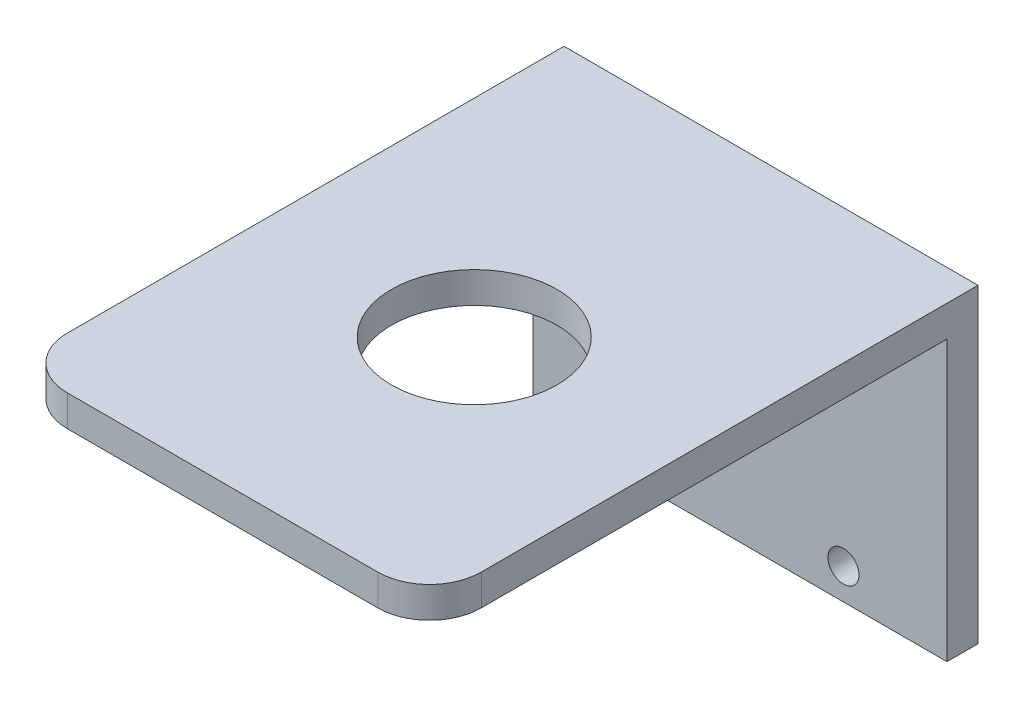
ISO-10303-21;
HEADER;
FILE_DESCRIPTION(('STEP AP214'),'2;1');
FILE_NAME('part.step','',(''),(''),'','','');
FILE_SCHEMA(('AUTOMOTIVE_DESIGN { 1 0 10303 214 1 1 1 1 }'));
ENDSEC;
DATA;
#1=APPLICATION_CONTEXT('core data for automotive mechanical design processes');
#2=APPLICATION_PROTOCOL_DEFINITION('international standard','automotive_design',2000,#1);
#3=PRODUCT_CONTEXT('',#1,'mechanical');
#4=PRODUCT('Part','Part','',(#3));
#5=PRODUCT_RELATED_PRODUCT_CATEGORY('part','',(#4));
#6=PRODUCT_DEFINITION_FORMATION('','',#4);
#7=PRODUCT_DEFINITION_CONTEXT('part definition',#1,'design');
#8=PRODUCT_DEFINITION('design','',#6,#7);
#9=PRODUCT_DEFINITION_SHAPE('','',#8);
#10=(LENGTH_UNIT() NAMED_UNIT(*) SI_UNIT(.MILLI.,.METRE.));
#11=(NAMED_UNIT(*) PLANE_ANGLE_UNIT() SI_UNIT($,.RADIAN.));
#12=(NAMED_UNIT(*) SI_UNIT($,.STERADIAN.) SOLID_ANGLE_UNIT());
#13=UNCERTAINTY_MEASURE_WITH_UNIT(LENGTH_MEASURE(1.E-05),#10,'distance_accuracy_value','');
#14=(GEOMETRIC_REPRESENTATION_CONTEXT(3) GLOBAL_UNCERTAINTY_ASSIGNED_CONTEXT((#13)) GLOBAL_UNIT_ASSIGNED_CONTEXT((#10,
#11,#12)) REPRESENTATION_CONTEXT('',''));
#15=CARTESIAN_POINT('',(0.,0.,0.));
#16=DIRECTION('',(0.,0.,1.));
#17=DIRECTION('',(1.,0.,0.));
#18=AXIS2_PLACEMENT_3D('',#15,#16,#17);
#19=CARTESIAN_POINT('',(0.,0.,3.));
#20=DIRECTION('',(0.,0.,1.));
#21=DIRECTION('',(1.,0.,0.));
#22=AXIS2_PLACEMENT_3D('',#19,#20,#21);
#23=PLANE('',#22);
#24=DIRECTION('',(1.,0.,0.));
#25=VECTOR('',#24,1.);
#26=CARTESIAN_POINT('',(-20.,12.,3.));
#27=LINE('',#26,#25);
#28=CARTESIAN_POINT('',(-20.,12.,3.));
#29=VERTEX_POINT('',#28);
#30=CARTESIAN_POINT('',(20.,12.,3.));
#31=VERTEX_POINT('',#30);
#32=EDGE_CURVE('E115',#29,#31,#27,.T.);
#33=ORIENTED_EDGE('',*,*,#32,.F.);
#34=DIRECTION('',(0.,-1.,0.));
#35=VECTOR('',#34,1.);
#36=CARTESIAN_POINT('',(-20.,15.,3.));
#37=LINE('',#36,#35);
#38=CARTESIAN_POINT('',(-20.,-15.,3.));
#39=VERTEX_POINT('',#38);
#40=EDGE_CURVE('E120',#29,#39,#37,.T.);
#41=ORIENTED_EDGE('',*,*,#40,.T.);
#42=DIRECTION('',(1.,0.,0.));
#43=VECTOR('',#42,1.);
#44=CARTESIAN_POINT('',(-20.,-15.,3.));
#45=LINE('',#44,#43);
#46=CARTESIAN_POINT('',(20.,-15.,3.));
#47=VERTEX_POINT('',#46);
#48=EDGE_CURVE('E118',#39,#47,#45,.T.);
#49=ORIENTED_EDGE('',*,*,#48,.T.);
#50=DIRECTION('',(0.,1.,0.));
#51=VECTOR('',#50,1.);
#52=CARTESIAN_POINT('',(20.,15.,3.));
#53=LINE('',#52,#51);
#54=EDGE_CURVE('E104',#47,#31,#53,.T.);
#55=ORIENTED_EDGE('',*,*,#54,.T.);
#56=EDGE_LOOP('',(#33,#41,#49,#55));
#57=FACE_BOUND('',#56,.T.);
#58=CARTESIAN_POINT('',(-9.99999999999979,-12.,3.));
#59=DIRECTION('',(0.,0.,1.));
#60=DIRECTION('',(1.,0.,0.));
#61=AXIS2_PLACEMENT_3D('',#58,#59,#60);
#62=CIRCLE('',#61,1.5);
#63=CARTESIAN_POINT('',(-8.49999999999979,-12.,3.));
#64=VERTEX_POINT('',#63);
#65=EDGE_CURVE('E149',#64,#64,#62,.T.);
#66=ORIENTED_EDGE('',*,*,#65,.F.);
#67=EDGE_LOOP('',(#66));
#68=FACE_BOUND('',#67,.T.);
#69=CARTESIAN_POINT('',(-10.,8.00000000000001,3.));
#70=DIRECTION('',(0.,0.,1.));
#71=DIRECTION('',(1.,0.,0.));
#72=AXIS2_PLACEMENT_3D('',#69,#70,#71);
#73=CIRCLE('',#72,1.5);
#74=CARTESIAN_POINT('',(-8.5,8.00000000000001,3.));
#75=VERTEX_POINT('',#74);
#76=EDGE_CURVE('E161',#75,#75,#73,.T.);
#77=ORIENTED_EDGE('',*,*,#76,.F.);
#78=EDGE_LOOP('',(#77));
#79=FACE_BOUND('',#78,.T.);
#80=CARTESIAN_POINT('',(10.,8.00000000000001,3.));
#81=DIRECTION('',(0.,0.,1.));
#82=DIRECTION('',(1.,0.,0.));
#83=AXIS2_PLACEMENT_3D('',#80,#81,#82);
#84=CIRCLE('',#83,1.5);
#85=CARTESIAN_POINT('',(11.5,8.00000000000001,3.));
#86=VERTEX_POINT('',#85);
#87=EDGE_CURVE('E155',#86,#86,#84,.T.);
#88=ORIENTED_EDGE('',*,*,#87,.F.);
#89=EDGE_LOOP('',(#88));
#90=FACE_BOUND('',#89,.T.);
#91=CARTESIAN_POINT('',(10.0000000000002,-12.,3.));
#92=DIRECTION('',(0.,0.,1.));
#93=DIRECTION('',(1.,0.,0.));
#94=AXIS2_PLACEMENT_3D('',#91,#92,#93);
#95=CIRCLE('',#94,1.5);
#96=CARTESIAN_POINT('',(11.5000000000002,-12.,3.));
#97=VERTEX_POINT('',#96);
#98=EDGE_CURVE('E142',#97,#97,#95,.T.);
#99=ORIENTED_EDGE('',*,*,#98,.F.);
#100=EDGE_LOOP('',(#99));
#101=FACE_BOUND('',#100,.T.);
#102=ADVANCED_FACE('F35',(#57,#68,#79,#90,#101),#23,.T.);
#103=CARTESIAN_POINT('',(0.,0.,0.));
#104=DIRECTION('',(0.,0.,1.));
#105=DIRECTION('',(1.,0.,0.));
#106=AXIS2_PLACEMENT_3D('',#103,#104,#105);
#107=PLANE('',#106);
#108=CARTESIAN_POINT('',(-9.99999999999979,-12.,0.));
#109=DIRECTION('',(0.,0.,1.));
#110=DIRECTION('',(1.,0.,0.));
#111=AXIS2_PLACEMENT_3D('',#108,#109,#110);
#112=CIRCLE('',#111,1.5);
#113=CARTESIAN_POINT('',(-8.49999999999979,-12.,0.));
#114=VERTEX_POINT('',#113);
#115=EDGE_CURVE('E145',#114,#114,#112,.T.);
#116=ORIENTED_EDGE('',*,*,#115,.T.);
#117=EDGE_LOOP('',(#116));
#118=FACE_BOUND('',#117,.T.);
#119=CARTESIAN_POINT('',(-10.,8.00000000000001,0.));
#120=DIRECTION('',(0.,0.,1.));
#121=DIRECTION('',(1.,0.,0.));
#122=AXIS2_PLACEMENT_3D('',#119,#120,#121);
#123=CIRCLE('',#122,1.5);
#124=CARTESIAN_POINT('',(-8.5,8.00000000000001,0.));
#125=VERTEX_POINT('',#124);
#126=EDGE_CURVE('E158',#125,#125,#123,.T.);
#127=ORIENTED_EDGE('',*,*,#126,.T.);
#128=EDGE_LOOP('',(#127));
#129=FACE_BOUND('',#128,.T.);
#130=DIRECTION('',(0.,1.,0.));
#131=VECTOR('',#130,1.);
#132=CARTESIAN_POINT('',(20.,15.,0.));
#133=LINE('',#132,#131);
#134=CARTESIAN_POINT('',(20.,-15.,0.));
#135=VERTEX_POINT('',#134);
#136=CARTESIAN_POINT('',(20.,15.,0.));
#137=VERTEX_POINT('',#136);
#138=EDGE_CURVE('E164',#135,#137,#133,.T.);
#139=ORIENTED_EDGE('',*,*,#138,.F.);
#140=DIRECTION('',(1.,0.,0.));
#141=VECTOR('',#140,1.);
#142=CARTESIAN_POINT('',(-20.,-15.,0.));
#143=LINE('',#142,#141);
#144=CARTESIAN_POINT('',(-20.,-15.,0.));
#145=VERTEX_POINT('',#144);
#146=EDGE_CURVE('E121',#145,#135,#143,.T.);
#147=ORIENTED_EDGE('',*,*,#146,.F.);
#148=DIRECTION('',(0.,-1.,0.));
#149=VECTOR('',#148,1.);
#150=CARTESIAN_POINT('',(-20.,15.,0.));
#151=LINE('',#150,#149);
#152=CARTESIAN_POINT('',(-20.,15.,0.));
#153=VERTEX_POINT('',#152);
#154=EDGE_CURVE('E182',#153,#145,#151,.T.);
#155=ORIENTED_EDGE('',*,*,#154,.F.);
#156=DIRECTION('',(-1.,0.,0.));
#157=VECTOR('',#156,1.);
#158=CARTESIAN_POINT('',(-20.,15.,0.));
#159=LINE('',#158,#157);
#160=EDGE_CURVE('E184',#137,#153,#159,.T.);
#161=ORIENTED_EDGE('',*,*,#160,.F.);
#162=EDGE_LOOP('',(#139,#147,#155,#161));
#163=FACE_BOUND('',#162,.T.);
#164=CARTESIAN_POINT('',(10.,8.00000000000001,0.));
#165=DIRECTION('',(0.,0.,1.));
#166=DIRECTION('',(1.,0.,0.));
#167=AXIS2_PLACEMENT_3D('',#164,#165,#166);
#168=CIRCLE('',#167,1.5);
#169=CARTESIAN_POINT('',(11.5,8.00000000000001,0.));
#170=VERTEX_POINT('',#169);
#171=EDGE_CURVE('E152',#170,#170,#168,.T.);
#172=ORIENTED_EDGE('',*,*,#171,.T.);
#173=EDGE_LOOP('',(#172));
#174=FACE_BOUND('',#173,.T.);
#175=CARTESIAN_POINT('',(10.0000000000002,-12.,0.));
#176=DIRECTION('',(0.,0.,1.));
#177=DIRECTION('',(1.,0.,0.));
#178=AXIS2_PLACEMENT_3D('',#175,#176,#177);
#179=CIRCLE('',#178,1.5);
#180=CARTESIAN_POINT('',(11.5000000000002,-12.,0.));
#181=VERTEX_POINT('',#180);
#182=EDGE_CURVE('E146',#181,#181,#179,.T.);
#183=ORIENTED_EDGE('',*,*,#182,.T.);
#184=EDGE_LOOP('',(#183));
#185=FACE_BOUND('',#184,.T.);
#186=ADVANCED_FACE('F197',(#118,#129,#163,#174,#185),#107,.F.);
#187=CARTESIAN_POINT('',(20.,15.,3.));
#188=DIRECTION('',(-1.,0.,0.));
#189=DIRECTION('',(0.,-1.,0.));
#190=AXIS2_PLACEMENT_3D('',#187,#188,#189);
#191=PLANE('',#190);
#192=DIRECTION('',(0.,0.,-1.));
#193=VECTOR('',#192,1.);
#194=CARTESIAN_POINT('',(20.,15.,3.));
#195=LINE('',#194,#193);
#196=CARTESIAN_POINT('',(20.,15.,48.));
#197=VERTEX_POINT('',#196);
#198=EDGE_CURVE('E171',#197,#137,#195,.T.);
#199=ORIENTED_EDGE('',*,*,#198,.F.);
#200=DIRECTION('',(0.,1.,0.));
#201=VECTOR('',#200,1.);
#202=CARTESIAN_POINT('',(20.,12.,48.));
#203=LINE('',#202,#201);
#204=CARTESIAN_POINT('',(20.,12.,48.));
#205=VERTEX_POINT('',#204);
#206=EDGE_CURVE('E11',#197,#205,#203,.F.);
#207=ORIENTED_EDGE('',*,*,#206,.T.);
#208=DIRECTION('',(0.,0.,-1.));
#209=VECTOR('',#208,1.);
#210=CARTESIAN_POINT('',(20.,12.,53.));
#211=LINE('',#210,#209);
#212=EDGE_CURVE('E100',#205,#31,#211,.T.);
#213=ORIENTED_EDGE('',*,*,#212,.T.);
#214=ORIENTED_EDGE('',*,*,#54,.F.);
#215=DIRECTION('',(0.,0.,-1.));
#216=VECTOR('',#215,1.);
#217=CARTESIAN_POINT('',(20.,-15.,3.));
#218=LINE('',#217,#216);
#219=EDGE_CURVE('E179',#47,#135,#218,.T.);
#220=ORIENTED_EDGE('',*,*,#219,.T.);
#221=ORIENTED_EDGE('',*,*,#138,.T.);
#222=EDGE_LOOP('',(#199,#207,#213,#214,#220,#221));
#223=FACE_BOUND('',#222,.T.);
#224=ADVANCED_FACE('F102',(#223),#191,.F.);
#225=CARTESIAN_POINT('',(-20.,15.,3.));
#226=DIRECTION('',(0.,-1.,0.));
#227=DIRECTION('',(0.,0.,-1.));
#228=AXIS2_PLACEMENT_3D('',#225,#226,#227);
#229=PLANE('',#228);
#230=CARTESIAN_POINT('',(0.,15.,28.6810804826567));
#231=DIRECTION('',(0.,1.,0.));
#232=DIRECTION('',(0.,0.,1.));
#233=AXIS2_PLACEMENT_3D('',#230,#231,#232);
#234=CIRCLE('',#233,8.);
#235=CARTESIAN_POINT('',(0.,15.,36.6810804826567));
#236=VERTEX_POINT('',#235);
#237=EDGE_CURVE('E131',#236,#236,#234,.T.);
#238=ORIENTED_EDGE('',*,*,#237,.F.);
#239=EDGE_LOOP('',(#238));
#240=FACE_BOUND('',#239,.T.);
#241=DIRECTION('',(0.,0.,-1.));
#242=VECTOR('',#241,1.);
#243=CARTESIAN_POINT('',(-20.,15.,3.));
#244=LINE('',#243,#242);
#245=CARTESIAN_POINT('',(-20.,15.,48.));
#246=VERTEX_POINT('',#245);
#247=EDGE_CURVE('E174',#246,#153,#244,.T.);
#248=ORIENTED_EDGE('',*,*,#247,.F.);
#249=CARTESIAN_POINT('',(-15.,15.,48.));
#250=DIRECTION('',(0.,-1.,0.));
#251=DIRECTION('',(0.,0.,-1.));
#252=AXIS2_PLACEMENT_3D('',#249,#250,#251);
#253=CIRCLE('',#252,5.);
#254=CARTESIAN_POINT('',(-15.,15.,53.));
#255=VERTEX_POINT('',#254);
#256=EDGE_CURVE('E43',#246,#255,#253,.F.);
#257=ORIENTED_EDGE('',*,*,#256,.T.);
#258=DIRECTION('',(-1.,0.,0.));
#259=VECTOR('',#258,1.);
#260=CARTESIAN_POINT('',(-20.,15.,53.));
#261=LINE('',#260,#259);
#262=CARTESIAN_POINT('',(15.,15.,53.));
#263=VERTEX_POINT('',#262);
#264=EDGE_CURVE('E110',#263,#255,#261,.T.);
#265=ORIENTED_EDGE('',*,*,#264,.F.);
#266=CARTESIAN_POINT('',(15.,15.,48.));
#267=DIRECTION('',(0.,-1.,0.));
#268=DIRECTION('',(0.,0.,-1.));
#269=AXIS2_PLACEMENT_3D('',#266,#267,#268);
#270=CIRCLE('',#269,5.);
#271=EDGE_CURVE('E50',#263,#197,#270,.F.);
#272=ORIENTED_EDGE('',*,*,#271,.T.);
#273=ORIENTED_EDGE('',*,*,#198,.T.);
#274=ORIENTED_EDGE('',*,*,#160,.T.);
#275=EDGE_LOOP('',(#248,#257,#265,#272,#273,#274));
#276=FACE_BOUND('',#275,.T.);
#277=ADVANCED_FACE('F199',(#240,#276),#229,.F.);
#278=CARTESIAN_POINT('',(-20.,15.,3.));
#279=DIRECTION('',(1.,0.,0.));
#280=DIRECTION('',(0.,1.,0.));
#281=AXIS2_PLACEMENT_3D('',#278,#279,#280);
#282=PLANE('',#281);
#283=DIRECTION('',(0.,0.,-1.));
#284=VECTOR('',#283,1.);
#285=CARTESIAN_POINT('',(-20.,12.,53.));
#286=LINE('',#285,#284);
#287=CARTESIAN_POINT('',(-20.,12.,48.));
#288=VERTEX_POINT('',#287);
#289=EDGE_CURVE('E109',#288,#29,#286,.T.);
#290=ORIENTED_EDGE('',*,*,#289,.F.);
#291=DIRECTION('',(0.,-1.,0.));
#292=VECTOR('',#291,1.);
#293=CARTESIAN_POINT('',(-20.,15.,48.));
#294=LINE('',#293,#292);
#295=EDGE_CURVE('E58',#288,#246,#294,.F.);
#296=ORIENTED_EDGE('',*,*,#295,.T.);
#297=ORIENTED_EDGE('',*,*,#247,.T.);
#298=ORIENTED_EDGE('',*,*,#154,.T.);
#299=DIRECTION('',(0.,0.,-1.));
#300=VECTOR('',#299,1.);
#301=CARTESIAN_POINT('',(-20.,-15.,3.));
#302=LINE('',#301,#300);
#303=EDGE_CURVE('E176',#39,#145,#302,.T.);
#304=ORIENTED_EDGE('',*,*,#303,.F.);
#305=ORIENTED_EDGE('',*,*,#40,.F.);
#306=EDGE_LOOP('',(#290,#296,#297,#298,#304,#305));
#307=FACE_BOUND('',#306,.T.);
#308=ADVANCED_FACE('F189',(#307),#282,.F.);
#309=CARTESIAN_POINT('',(-20.,-15.,3.));
#310=DIRECTION('',(0.,1.,0.));
#311=DIRECTION('',(0.,0.,1.));
#312=AXIS2_PLACEMENT_3D('',#309,#310,#311);
#313=PLANE('',#312);
#314=ORIENTED_EDGE('',*,*,#146,.T.);
#315=ORIENTED_EDGE('',*,*,#219,.F.);
#316=ORIENTED_EDGE('',*,*,#48,.F.);
#317=ORIENTED_EDGE('',*,*,#303,.T.);
#318=EDGE_LOOP('',(#314,#315,#316,#317));
#319=FACE_BOUND('',#318,.T.);
#320=ADVANCED_FACE('F193',(#319),#313,.F.);
#321=CARTESIAN_POINT('',(-10.,8.00000000000001,3.));
#322=DIRECTION('',(0.,0.,-1.));
#323=DIRECTION('',(-1.,0.,0.));
#324=AXIS2_PLACEMENT_3D('',#321,#322,#323);
#325=CYLINDRICAL_SURFACE('',#324,1.5);
#326=ORIENTED_EDGE('',*,*,#76,.T.);
#327=EDGE_LOOP('',(#326));
#328=FACE_BOUND('',#327,.T.);
#329=ORIENTED_EDGE('',*,*,#126,.F.);
#330=EDGE_LOOP('',(#329));
#331=FACE_BOUND('',#330,.T.);
#332=ADVANCED_FACE('F236',(#328,#331),#325,.F.);
#333=CARTESIAN_POINT('',(10.,8.00000000000001,3.));
#334=DIRECTION('',(0.,0.,-1.));
#335=DIRECTION('',(-1.,0.,0.));
#336=AXIS2_PLACEMENT_3D('',#333,#334,#335);
#337=CYLINDRICAL_SURFACE('',#336,1.5);
#338=ORIENTED_EDGE('',*,*,#87,.T.);
#339=EDGE_LOOP('',(#338));
#340=FACE_BOUND('',#339,.T.);
#341=ORIENTED_EDGE('',*,*,#171,.F.);
#342=EDGE_LOOP('',(#341));
#343=FACE_BOUND('',#342,.T.);
#344=ADVANCED_FACE('F271',(#340,#343),#337,.F.);
#345=CARTESIAN_POINT('',(-9.99999999999979,-12.,3.));
#346=DIRECTION('',(0.,0.,-1.));
#347=DIRECTION('',(-1.,0.,0.));
#348=AXIS2_PLACEMENT_3D('',#345,#346,#347);
#349=CYLINDRICAL_SURFACE('',#348,1.5);
#350=ORIENTED_EDGE('',*,*,#65,.T.);
#351=EDGE_LOOP('',(#350));
#352=FACE_BOUND('',#351,.T.);
#353=ORIENTED_EDGE('',*,*,#115,.F.);
#354=EDGE_LOOP('',(#353));
#355=FACE_BOUND('',#354,.T.);
#356=ADVANCED_FACE('F278',(#352,#355),#349,.F.);
#357=CARTESIAN_POINT('',(10.0000000000002,-12.,3.));
#358=DIRECTION('',(0.,0.,-1.));
#359=DIRECTION('',(-1.,0.,0.));
#360=AXIS2_PLACEMENT_3D('',#357,#358,#359);
#361=CYLINDRICAL_SURFACE('',#360,1.5);
#362=ORIENTED_EDGE('',*,*,#98,.T.);
#363=EDGE_LOOP('',(#362));
#364=FACE_BOUND('',#363,.T.);
#365=ORIENTED_EDGE('',*,*,#182,.F.);
#366=EDGE_LOOP('',(#365));
#367=FACE_BOUND('',#366,.T.);
#368=ADVANCED_FACE('F285',(#364,#367),#361,.F.);
#369=CARTESIAN_POINT('',(-20.,12.,53.));
#370=DIRECTION('',(0.,1.,0.));
#371=DIRECTION('',(0.,0.,1.));
#372=AXIS2_PLACEMENT_3D('',#369,#370,#371);
#373=PLANE('',#372);
#374=CARTESIAN_POINT('',(0.,12.,28.6810804826567));
#375=DIRECTION('',(0.,1.,0.));
#376=DIRECTION('',(0.,0.,1.));
#377=AXIS2_PLACEMENT_3D('',#374,#375,#376);
#378=CIRCLE('',#377,8.);
#379=CARTESIAN_POINT('',(0.,12.,36.6810804826567));
#380=VERTEX_POINT('',#379);
#381=EDGE_CURVE('E126',#380,#380,#378,.F.);
#382=ORIENTED_EDGE('',*,*,#381,.F.);
#383=EDGE_LOOP('',(#382));
#384=FACE_BOUND('',#383,.T.);
#385=DIRECTION('',(1.,0.,0.));
#386=VECTOR('',#385,1.);
#387=CARTESIAN_POINT('',(-20.,12.,53.));
#388=LINE('',#387,#386);
#389=CARTESIAN_POINT('',(-15.,12.,53.));
#390=VERTEX_POINT('',#389);
#391=CARTESIAN_POINT('',(15.,12.,53.));
#392=VERTEX_POINT('',#391);
#393=EDGE_CURVE('E125',#390,#392,#388,.T.);
#394=ORIENTED_EDGE('',*,*,#393,.F.);
#395=CARTESIAN_POINT('',(-15.,12.,48.));
#396=DIRECTION('',(0.,1.,0.));
#397=DIRECTION('',(0.,0.,1.));
#398=AXIS2_PLACEMENT_3D('',#395,#396,#397);
#399=CIRCLE('',#398,5.);
#400=EDGE_CURVE('E205',#390,#288,#399,.F.);
#401=ORIENTED_EDGE('',*,*,#400,.T.);
#402=ORIENTED_EDGE('',*,*,#289,.T.);
#403=ORIENTED_EDGE('',*,*,#32,.T.);
#404=ORIENTED_EDGE('',*,*,#212,.F.);
#405=CARTESIAN_POINT('',(15.,12.,48.));
#406=DIRECTION('',(0.,1.,0.));
#407=DIRECTION('',(0.,0.,1.));
#408=AXIS2_PLACEMENT_3D('',#405,#406,#407);
#409=CIRCLE('',#408,5.);
#410=EDGE_CURVE('E204',#205,#392,#409,.F.);
#411=ORIENTED_EDGE('',*,*,#410,.T.);
#412=EDGE_LOOP('',(#394,#401,#402,#403,#404,#411));
#413=FACE_BOUND('',#412,.T.);
#414=ADVANCED_FACE('F124',(#384,#413),#373,.F.);
#415=CARTESIAN_POINT('',(0.,0.,53.));
#416=DIRECTION('',(0.,0.,1.));
#417=DIRECTION('',(1.,0.,0.));
#418=AXIS2_PLACEMENT_3D('',#415,#416,#417);
#419=PLANE('',#418);
#420=ORIENTED_EDGE('',*,*,#264,.T.);
#421=DIRECTION('',(0.,-1.,0.));
#422=VECTOR('',#421,1.);
#423=CARTESIAN_POINT('',(-15.,12.,53.));
#424=LINE('',#423,#422);
#425=EDGE_CURVE('E206',#255,#390,#424,.T.);
#426=ORIENTED_EDGE('',*,*,#425,.T.);
#427=ORIENTED_EDGE('',*,*,#393,.T.);
#428=DIRECTION('',(0.,1.,0.));
#429=VECTOR('',#428,1.);
#430=CARTESIAN_POINT('',(15.,15.,53.));
#431=LINE('',#430,#429);
#432=EDGE_CURVE('E173',#392,#263,#431,.T.);
#433=ORIENTED_EDGE('',*,*,#432,.T.);
#434=EDGE_LOOP('',(#420,#426,#427,#433));
#435=FACE_BOUND('',#434,.T.);
#436=ADVANCED_FACE('F218',(#435),#419,.T.);
#437=CARTESIAN_POINT('',(-15.,0.,48.));
#438=DIRECTION('',(0.,1.,0.));
#439=DIRECTION('',(-1.,0.,0.));
#440=AXIS2_PLACEMENT_3D('',#437,#438,#439);
#441=CYLINDRICAL_SURFACE('',#440,5.);
#442=ORIENTED_EDGE('',*,*,#256,.F.);
#443=ORIENTED_EDGE('',*,*,#295,.F.);
#444=ORIENTED_EDGE('',*,*,#400,.F.);
#445=ORIENTED_EDGE('',*,*,#425,.F.);
#446=EDGE_LOOP('',(#442,#443,#444,#445));
#447=FACE_BOUND('',#446,.T.);
#448=ADVANCED_FACE('F219',(#447),#441,.T.);
#449=CARTESIAN_POINT('',(15.,0.,48.));
#450=DIRECTION('',(0.,-1.,0.));
#451=DIRECTION('',(1.,0.,0.));
#452=AXIS2_PLACEMENT_3D('',#449,#450,#451);
#453=CYLINDRICAL_SURFACE('',#452,5.);
#454=ORIENTED_EDGE('',*,*,#410,.F.);
#455=ORIENTED_EDGE('',*,*,#206,.F.);
#456=ORIENTED_EDGE('',*,*,#271,.F.);
#457=ORIENTED_EDGE('',*,*,#432,.F.);
#458=EDGE_LOOP('',(#454,#455,#456,#457));
#459=FACE_BOUND('',#458,.T.);
#460=ADVANCED_FACE('F37',(#459),#453,.T.);
#461=CARTESIAN_POINT('',(0.,-10.6274169979695,28.6810804826567));
#462=DIRECTION('',(0.,1.,0.));
#463=DIRECTION('',(0.,0.,1.));
#464=AXIS2_PLACEMENT_3D('',#461,#462,#463);
#465=CYLINDRICAL_SURFACE('',#464,8.);
#466=ORIENTED_EDGE('',*,*,#381,.T.);
#467=EDGE_LOOP('',(#466));
#468=FACE_BOUND('',#467,.T.);
#469=ORIENTED_EDGE('',*,*,#237,.T.);
#470=EDGE_LOOP('',(#469));
#471=FACE_BOUND('',#470,.T.);
#472=ADVANCED_FACE('F225',(#468,#471),#465,.F.);
#473=CLOSED_SHELL('',(#102,#186,#224,#277,#308,#320,#332,#344,#356,#368,#414,#436,#448,#460,#472));
#474=MANIFOLD_SOLID_BREP('B2',#473);
#475=ADVANCED_BREP_SHAPE_REPRESENTATION('',(#18,#474),#14);
#476=SHAPE_DEFINITION_REPRESENTATION(#9,#475);
ENDSEC;
END-ISO-10303-21;
